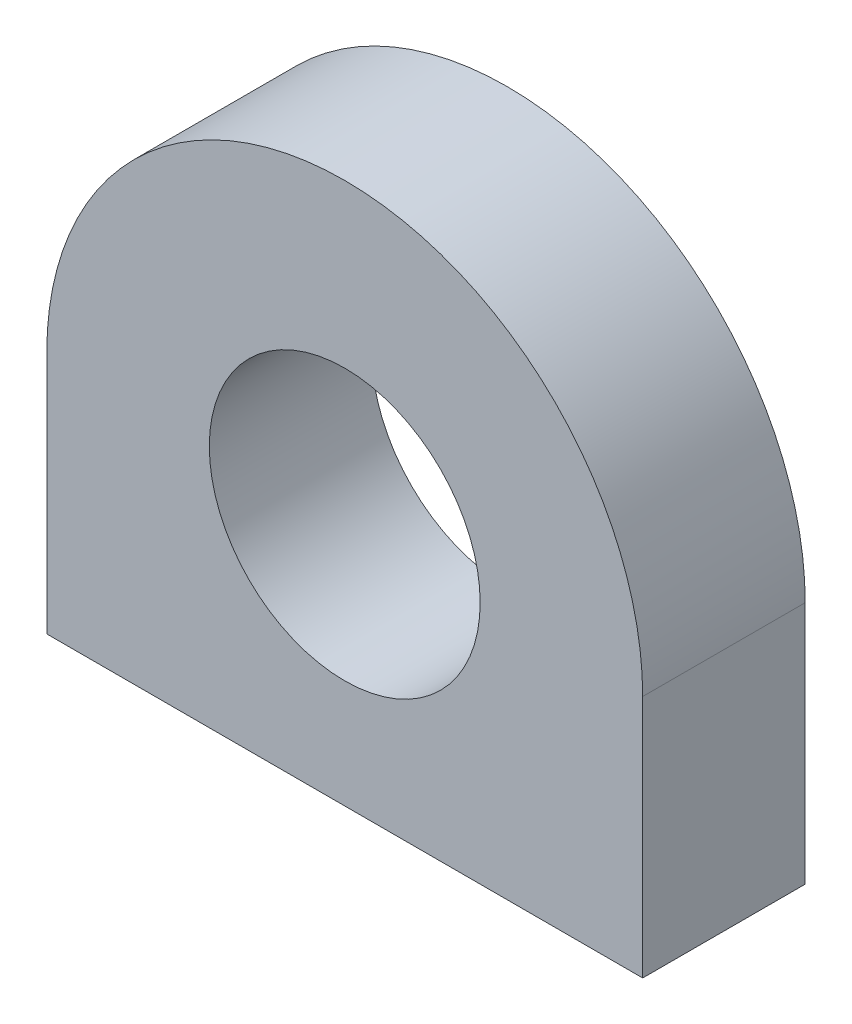
ISO-10303-21;
HEADER;
FILE_DESCRIPTION(('STEP AP214'),'2;1');
FILE_NAME('part.step','',(''),(''),'','','');
FILE_SCHEMA(('AUTOMOTIVE_DESIGN { 1 0 10303 214 1 1 1 1 }'));
ENDSEC;
DATA;
#1=APPLICATION_CONTEXT('core data for automotive mechanical design processes');
#2=APPLICATION_PROTOCOL_DEFINITION('international standard','automotive_design',2000,#1);
#3=PRODUCT_CONTEXT('',#1,'mechanical');
#4=PRODUCT('Part','Part','',(#3));
#5=PRODUCT_RELATED_PRODUCT_CATEGORY('part','',(#4));
#6=PRODUCT_DEFINITION_FORMATION('','',#4);
#7=PRODUCT_DEFINITION_CONTEXT('part definition',#1,'design');
#8=PRODUCT_DEFINITION('design','',#6,#7);
#9=PRODUCT_DEFINITION_SHAPE('','',#8);
#10=(LENGTH_UNIT() NAMED_UNIT(*) SI_UNIT(.MILLI.,.METRE.));
#11=(NAMED_UNIT(*) PLANE_ANGLE_UNIT() SI_UNIT($,.RADIAN.));
#12=(NAMED_UNIT(*) SI_UNIT($,.STERADIAN.) SOLID_ANGLE_UNIT());
#13=UNCERTAINTY_MEASURE_WITH_UNIT(LENGTH_MEASURE(1.E-05),#10,'distance_accuracy_value','');
#14=(GEOMETRIC_REPRESENTATION_CONTEXT(3) GLOBAL_UNCERTAINTY_ASSIGNED_CONTEXT((#13)) GLOBAL_UNIT_ASSIGNED_CONTEXT((#10,
#11,#12)) REPRESENTATION_CONTEXT('',''));
#15=CARTESIAN_POINT('',(0.,0.,0.));
#16=DIRECTION('',(0.,0.,1.));
#17=DIRECTION('',(1.,0.,0.));
#18=AXIS2_PLACEMENT_3D('',#15,#16,#17);
#19=CARTESIAN_POINT('',(-55.,45.,30.));
#20=DIRECTION('',(0.,0.,-1.));
#21=DIRECTION('',(-1.,0.,0.));
#22=AXIS2_PLACEMENT_3D('',#19,#20,#21);
#23=PLANE('',#22);
#24=DIRECTION('',(0.,1.,0.));
#25=VECTOR('',#24,1.);
#26=CARTESIAN_POINT('',(0.,45.,30.));
#27=LINE('',#26,#25);
#28=CARTESIAN_POINT('',(0.,0.,30.));
#29=VERTEX_POINT('',#28);
#30=CARTESIAN_POINT('',(0.,45.,30.));
#31=VERTEX_POINT('',#30);
#32=EDGE_CURVE('E92',#29,#31,#27,.T.);
#33=ORIENTED_EDGE('',*,*,#32,.T.);
#34=CARTESIAN_POINT('',(-55.,45.,30.));
#35=DIRECTION('',(0.,0.,1.));
#36=DIRECTION('',(-1.,0.,0.));
#37=AXIS2_PLACEMENT_3D('',#34,#35,#36);
#38=CIRCLE('',#37,55.);
#39=CARTESIAN_POINT('',(-110.,45.,30.));
#40=VERTEX_POINT('',#39);
#41=EDGE_CURVE('E87',#31,#40,#38,.T.);
#42=ORIENTED_EDGE('',*,*,#41,.T.);
#43=DIRECTION('',(0.,-1.,0.));
#44=VECTOR('',#43,1.);
#45=CARTESIAN_POINT('',(-110.,0.,30.));
#46=LINE('',#45,#44);
#47=CARTESIAN_POINT('',(-110.,0.,30.));
#48=VERTEX_POINT('',#47);
#49=EDGE_CURVE('E90',#40,#48,#46,.T.);
#50=ORIENTED_EDGE('',*,*,#49,.T.);
#51=DIRECTION('',(1.,0.,0.));
#52=VECTOR('',#51,1.);
#53=CARTESIAN_POINT('',(0.,0.,30.));
#54=LINE('',#53,#52);
#55=EDGE_CURVE('E57',#48,#29,#54,.T.);
#56=ORIENTED_EDGE('',*,*,#55,.T.);
#57=EDGE_LOOP('',(#33,#42,#50,#56));
#58=FACE_BOUND('',#57,.T.);
#59=CARTESIAN_POINT('',(-55.,45.,30.));
#60=DIRECTION('',(0.,0.,1.));
#61=DIRECTION('',(1.,0.,0.));
#62=AXIS2_PLACEMENT_3D('',#59,#60,#61);
#63=CIRCLE('',#62,25.);
#64=CARTESIAN_POINT('',(-30.,45.,30.));
#65=VERTEX_POINT('',#64);
#66=EDGE_CURVE('E112',#65,#65,#63,.T.);
#67=ORIENTED_EDGE('',*,*,#66,.F.);
#68=EDGE_LOOP('',(#67));
#69=FACE_BOUND('',#68,.T.);
#70=ADVANCED_FACE('F39',(#58,#69),#23,.F.);
#71=CARTESIAN_POINT('',(-55.,45.,0.));
#72=DIRECTION('',(0.,0.,-1.));
#73=DIRECTION('',(-1.,0.,0.));
#74=AXIS2_PLACEMENT_3D('',#71,#72,#73);
#75=PLANE('',#74);
#76=DIRECTION('',(0.,1.,0.));
#77=VECTOR('',#76,1.);
#78=CARTESIAN_POINT('',(0.,45.,0.));
#79=LINE('',#78,#77);
#80=CARTESIAN_POINT('',(0.,0.,0.));
#81=VERTEX_POINT('',#80);
#82=CARTESIAN_POINT('',(0.,45.,0.));
#83=VERTEX_POINT('',#82);
#84=EDGE_CURVE('E108',#81,#83,#79,.T.);
#85=ORIENTED_EDGE('',*,*,#84,.F.);
#86=DIRECTION('',(1.,0.,0.));
#87=VECTOR('',#86,1.);
#88=CARTESIAN_POINT('',(0.,0.,0.));
#89=LINE('',#88,#87);
#90=CARTESIAN_POINT('',(-110.,0.,0.));
#91=VERTEX_POINT('',#90);
#92=EDGE_CURVE('E80',#91,#81,#89,.T.);
#93=ORIENTED_EDGE('',*,*,#92,.F.);
#94=DIRECTION('',(0.,-1.,0.));
#95=VECTOR('',#94,1.);
#96=CARTESIAN_POINT('',(-110.,0.,0.));
#97=LINE('',#96,#95);
#98=CARTESIAN_POINT('',(-110.,45.,0.));
#99=VERTEX_POINT('',#98);
#100=EDGE_CURVE('E74',#99,#91,#97,.T.);
#101=ORIENTED_EDGE('',*,*,#100,.F.);
#102=CARTESIAN_POINT('',(-55.,45.,0.));
#103=DIRECTION('',(0.,0.,1.));
#104=DIRECTION('',(-1.,0.,0.));
#105=AXIS2_PLACEMENT_3D('',#102,#103,#104);
#106=CIRCLE('',#105,55.);
#107=EDGE_CURVE('E97',#83,#99,#106,.T.);
#108=ORIENTED_EDGE('',*,*,#107,.F.);
#109=EDGE_LOOP('',(#85,#93,#101,#108));
#110=FACE_BOUND('',#109,.T.);
#111=CARTESIAN_POINT('',(-55.,45.,0.));
#112=DIRECTION('',(0.,0.,1.));
#113=DIRECTION('',(1.,0.,0.));
#114=AXIS2_PLACEMENT_3D('',#111,#112,#113);
#115=CIRCLE('',#114,25.);
#116=CARTESIAN_POINT('',(-30.,45.,0.));
#117=VERTEX_POINT('',#116);
#118=EDGE_CURVE('E130',#117,#117,#115,.T.);
#119=ORIENTED_EDGE('',*,*,#118,.T.);
#120=EDGE_LOOP('',(#119));
#121=FACE_BOUND('',#120,.T.);
#122=ADVANCED_FACE('F125',(#110,#121),#75,.T.);
#123=CARTESIAN_POINT('',(0.,45.,30.));
#124=DIRECTION('',(-1.,0.,0.));
#125=DIRECTION('',(0.,0.,1.));
#126=AXIS2_PLACEMENT_3D('',#123,#124,#125);
#127=PLANE('',#126);
#128=ORIENTED_EDGE('',*,*,#84,.T.);
#129=DIRECTION('',(0.,0.,-1.));
#130=VECTOR('',#129,1.);
#131=CARTESIAN_POINT('',(0.,45.,30.));
#132=LINE('',#131,#130);
#133=EDGE_CURVE('E11',#31,#83,#132,.T.);
#134=ORIENTED_EDGE('',*,*,#133,.F.);
#135=ORIENTED_EDGE('',*,*,#32,.F.);
#136=DIRECTION('',(0.,0.,-1.));
#137=VECTOR('',#136,1.);
#138=CARTESIAN_POINT('',(0.,0.,30.));
#139=LINE('',#138,#137);
#140=EDGE_CURVE('E104',#29,#81,#139,.T.);
#141=ORIENTED_EDGE('',*,*,#140,.T.);
#142=EDGE_LOOP('',(#128,#134,#135,#141));
#143=FACE_BOUND('',#142,.T.);
#144=ADVANCED_FACE('F41',(#143),#127,.F.);
#145=CARTESIAN_POINT('',(-55.,45.,30.));
#146=DIRECTION('',(0.,0.,-1.));
#147=DIRECTION('',(-1.,0.,0.));
#148=AXIS2_PLACEMENT_3D('',#145,#146,#147);
#149=CYLINDRICAL_SURFACE('',#148,55.);
#150=ORIENTED_EDGE('',*,*,#107,.T.);
#151=DIRECTION('',(0.,0.,-1.));
#152=VECTOR('',#151,1.);
#153=CARTESIAN_POINT('',(-110.,45.,30.));
#154=LINE('',#153,#152);
#155=EDGE_CURVE('E49',#40,#99,#154,.T.);
#156=ORIENTED_EDGE('',*,*,#155,.F.);
#157=ORIENTED_EDGE('',*,*,#41,.F.);
#158=ORIENTED_EDGE('',*,*,#133,.T.);
#159=EDGE_LOOP('',(#150,#156,#157,#158));
#160=FACE_BOUND('',#159,.T.);
#161=ADVANCED_FACE('F96',(#160),#149,.T.);
#162=CARTESIAN_POINT('',(-110.,0.,30.));
#163=DIRECTION('',(1.,0.,0.));
#164=DIRECTION('',(0.,0.,-1.));
#165=AXIS2_PLACEMENT_3D('',#162,#163,#164);
#166=PLANE('',#165);
#167=ORIENTED_EDGE('',*,*,#100,.T.);
#168=DIRECTION('',(0.,0.,-1.));
#169=VECTOR('',#168,1.);
#170=CARTESIAN_POINT('',(-110.,0.,30.));
#171=LINE('',#170,#169);
#172=EDGE_CURVE('E99',#48,#91,#171,.T.);
#173=ORIENTED_EDGE('',*,*,#172,.F.);
#174=ORIENTED_EDGE('',*,*,#49,.F.);
#175=ORIENTED_EDGE('',*,*,#155,.T.);
#176=EDGE_LOOP('',(#167,#173,#174,#175));
#177=FACE_BOUND('',#176,.T.);
#178=ADVANCED_FACE('F100',(#177),#166,.F.);
#179=CARTESIAN_POINT('',(0.,0.,30.));
#180=DIRECTION('',(0.,1.,0.));
#181=DIRECTION('',(-1.,0.,0.));
#182=AXIS2_PLACEMENT_3D('',#179,#180,#181);
#183=PLANE('',#182);
#184=ORIENTED_EDGE('',*,*,#92,.T.);
#185=ORIENTED_EDGE('',*,*,#140,.F.);
#186=ORIENTED_EDGE('',*,*,#55,.F.);
#187=ORIENTED_EDGE('',*,*,#172,.T.);
#188=EDGE_LOOP('',(#184,#185,#186,#187));
#189=FACE_BOUND('',#188,.T.);
#190=ADVANCED_FACE('F122',(#189),#183,.F.);
#191=CARTESIAN_POINT('',(-55.,45.,30.));
#192=DIRECTION('',(0.,0.,-1.));
#193=DIRECTION('',(-1.,0.,0.));
#194=AXIS2_PLACEMENT_3D('',#191,#192,#193);
#195=CYLINDRICAL_SURFACE('',#194,25.);
#196=ORIENTED_EDGE('',*,*,#66,.T.);
#197=EDGE_LOOP('',(#196));
#198=FACE_BOUND('',#197,.T.);
#199=ORIENTED_EDGE('',*,*,#118,.F.);
#200=EDGE_LOOP('',(#199));
#201=FACE_BOUND('',#200,.T.);
#202=ADVANCED_FACE('F138',(#198,#201),#195,.F.);
#203=CLOSED_SHELL('',(#70,#122,#144,#161,#178,#190,#202));
#204=MANIFOLD_SOLID_BREP('B2',#203);
#205=ADVANCED_BREP_SHAPE_REPRESENTATION('',(#18,#204),#14);
#206=SHAPE_DEFINITION_REPRESENTATION(#9,#205);
ENDSEC;
END-ISO-10303-21;
